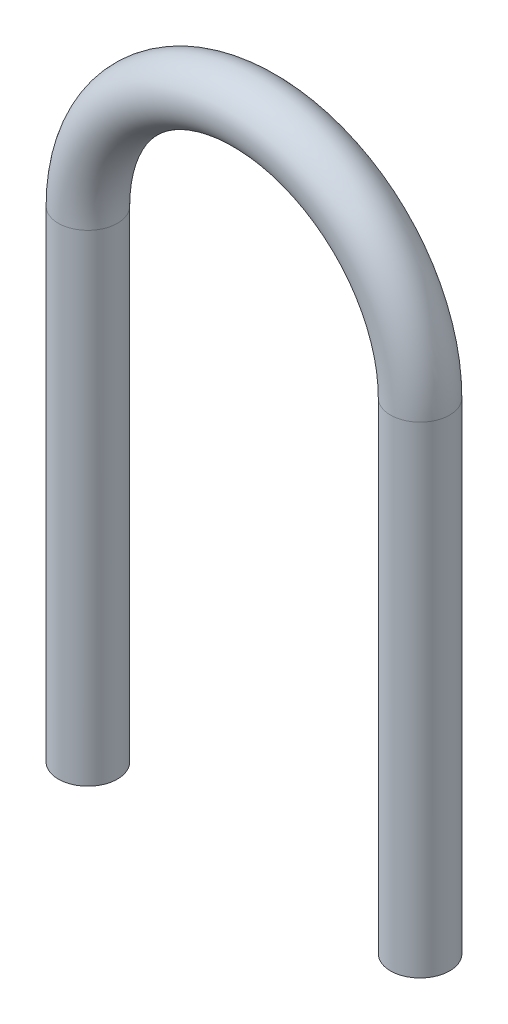
ISO-10303-21;
HEADER;
FILE_DESCRIPTION(('STEP AP214'),'2;1');
FILE_NAME('part.step','',(''),(''),'','','');
FILE_SCHEMA(('AUTOMOTIVE_DESIGN { 1 0 10303 214 1 1 1 1 }'));
ENDSEC;
DATA;
#1=APPLICATION_CONTEXT('core data for automotive mechanical design processes');
#2=APPLICATION_PROTOCOL_DEFINITION('international standard','automotive_design',2000,#1);
#3=PRODUCT_CONTEXT('',#1,'mechanical');
#4=PRODUCT('Part','Part','',(#3));
#5=PRODUCT_RELATED_PRODUCT_CATEGORY('part','',(#4));
#6=PRODUCT_DEFINITION_FORMATION('','',#4);
#7=PRODUCT_DEFINITION_CONTEXT('part definition',#1,'design');
#8=PRODUCT_DEFINITION('design','',#6,#7);
#9=PRODUCT_DEFINITION_SHAPE('','',#8);
#10=(LENGTH_UNIT() NAMED_UNIT(*) SI_UNIT(.MILLI.,.METRE.));
#11=(NAMED_UNIT(*) PLANE_ANGLE_UNIT() SI_UNIT($,.RADIAN.));
#12=(NAMED_UNIT(*) SI_UNIT($,.STERADIAN.) SOLID_ANGLE_UNIT());
#13=UNCERTAINTY_MEASURE_WITH_UNIT(LENGTH_MEASURE(1.E-05),#10,'distance_accuracy_value','');
#14=(GEOMETRIC_REPRESENTATION_CONTEXT(3) GLOBAL_UNCERTAINTY_ASSIGNED_CONTEXT((#13)) GLOBAL_UNIT_ASSIGNED_CONTEXT((#10,
#11,#12)) REPRESENTATION_CONTEXT('',''));
#15=CARTESIAN_POINT('',(0.,0.,0.));
#16=DIRECTION('',(0.,0.,1.));
#17=DIRECTION('',(1.,0.,0.));
#18=AXIS2_PLACEMENT_3D('',#15,#16,#17);
#19=CARTESIAN_POINT('',(-13.38125,0.,0.));
#20=DIRECTION('',(0.,-1.,0.));
#21=DIRECTION('',(0.,0.,1.));
#22=AXIS2_PLACEMENT_3D('',#19,#20,#21);
#23=PLANE('',#22);
#24=CARTESIAN_POINT('',(-13.38125,0.,0.));
#25=DIRECTION('',(0.,-1.,0.));
#26=DIRECTION('',(0.,0.,1.));
#27=AXIS2_PLACEMENT_3D('',#24,#25,#26);
#28=CIRCLE('',#27,2.38125);
#29=CARTESIAN_POINT('',(-13.38125,0.,2.38125));
#30=VERTEX_POINT('',#29);
#31=EDGE_CURVE('E48',#30,#30,#28,.T.);
#32=ORIENTED_EDGE('',*,*,#31,.T.);
#33=EDGE_LOOP('',(#32));
#34=FACE_BOUND('',#33,.T.);
#35=ADVANCED_FACE('F36',(#34),#23,.T.);
#36=CARTESIAN_POINT('',(13.38125,0.,0.));
#37=DIRECTION('',(0.,1.,0.));
#38=DIRECTION('',(0.,0.,1.));
#39=AXIS2_PLACEMENT_3D('',#36,#37,#38);
#40=PLANE('',#39);
#41=CARTESIAN_POINT('',(13.38125,0.,0.));
#42=DIRECTION('',(0.,1.,0.));
#43=DIRECTION('',(0.,0.,1.));
#44=AXIS2_PLACEMENT_3D('',#41,#42,#43);
#45=CIRCLE('',#44,2.38125);
#46=CARTESIAN_POINT('',(13.38125,0.,2.38125));
#47=VERTEX_POINT('',#46);
#48=EDGE_CURVE('E11',#47,#47,#45,.T.);
#49=ORIENTED_EDGE('',*,*,#48,.F.);
#50=EDGE_LOOP('',(#49));
#51=FACE_BOUND('',#50,.T.);
#52=ADVANCED_FACE('F54',(#51),#40,.F.);
#53=CARTESIAN_POINT('',(-13.38125,0.,0.));
#54=DIRECTION('',(0.,1.,0.));
#55=DIRECTION('',(-1.,0.,0.));
#56=AXIS2_PLACEMENT_3D('',#53,#54,#55);
#57=CYLINDRICAL_SURFACE('',#56,2.38125);
#58=CARTESIAN_POINT('',(-13.38125,38.78125,0.));
#59=DIRECTION('',(0.,-1.,0.));
#60=DIRECTION('',(0.,0.,1.));
#61=AXIS2_PLACEMENT_3D('',#58,#59,#60);
#62=CIRCLE('',#61,2.38125);
#63=CARTESIAN_POINT('',(-15.7625,38.78125,0.));
#64=VERTEX_POINT('',#63);
#65=EDGE_CURVE('E79',#64,#64,#62,.T.);
#66=ORIENTED_EDGE('',*,*,#65,.T.);
#67=EDGE_LOOP('',(#66));
#68=FACE_BOUND('',#67,.T.);
#69=ORIENTED_EDGE('',*,*,#31,.F.);
#70=EDGE_LOOP('',(#69));
#71=FACE_BOUND('',#70,.T.);
#72=ADVANCED_FACE('F56',(#68,#71),#57,.T.);
#73=CARTESIAN_POINT('',(0.,38.78125,0.));
#74=DIRECTION('',(0.,0.,-1.));
#75=DIRECTION('',(-1.,0.,0.));
#76=AXIS2_PLACEMENT_3D('',#73,#74,#75);
#77=TOROIDAL_SURFACE('',#76,13.38125,2.38125);
#78=CARTESIAN_POINT('',(13.38125,38.78125,0.));
#79=DIRECTION('',(0.,1.,0.));
#80=DIRECTION('',(0.,0.,1.));
#81=AXIS2_PLACEMENT_3D('',#78,#79,#80);
#82=CIRCLE('',#81,2.38125);
#83=CARTESIAN_POINT('',(15.7625,38.78125,0.));
#84=VERTEX_POINT('',#83);
#85=EDGE_CURVE('E43',#84,#84,#82,.T.);
#86=CARTESIAN_POINT('',(0.,38.78125,0.));
#87=DIRECTION('',(0.,0.,-1.));
#88=DIRECTION('',(-1.,0.,0.));
#89=AXIS2_PLACEMENT_3D('',#86,#87,#88);
#90=CIRCLE('',#89,15.7625);
#91=EDGE_CURVE('',#64,#84,#90,.T.);
#92=ORIENTED_EDGE('',*,*,#65,.F.);
#93=ORIENTED_EDGE('',*,*,#85,.T.);
#94=ORIENTED_EDGE('',*,*,#91,.T.);
#95=ORIENTED_EDGE('',*,*,#91,.F.);
#96=EDGE_LOOP('',(#92,#94,#93,#95));
#97=FACE_BOUND('',#96,.T.);
#98=ADVANCED_FACE('F61',(#97),#77,.T.);
#99=CARTESIAN_POINT('',(13.38125,38.78125,0.));
#100=DIRECTION('',(0.,-1.,0.));
#101=DIRECTION('',(1.,0.,0.));
#102=AXIS2_PLACEMENT_3D('',#99,#100,#101);
#103=CYLINDRICAL_SURFACE('',#102,2.38125);
#104=ORIENTED_EDGE('',*,*,#48,.T.);
#105=EDGE_LOOP('',(#104));
#106=FACE_BOUND('',#105,.T.);
#107=ORIENTED_EDGE('',*,*,#85,.F.);
#108=EDGE_LOOP('',(#107));
#109=FACE_BOUND('',#108,.T.);
#110=ADVANCED_FACE('F51',(#106,#109),#103,.T.);
#111=CLOSED_SHELL('',(#35,#52,#72,#98,#110));
#112=MANIFOLD_SOLID_BREP('B2',#111);
#113=ADVANCED_BREP_SHAPE_REPRESENTATION('',(#18,#112),#14);
#114=SHAPE_DEFINITION_REPRESENTATION(#9,#113);
ENDSEC;
END-ISO-10303-21;
